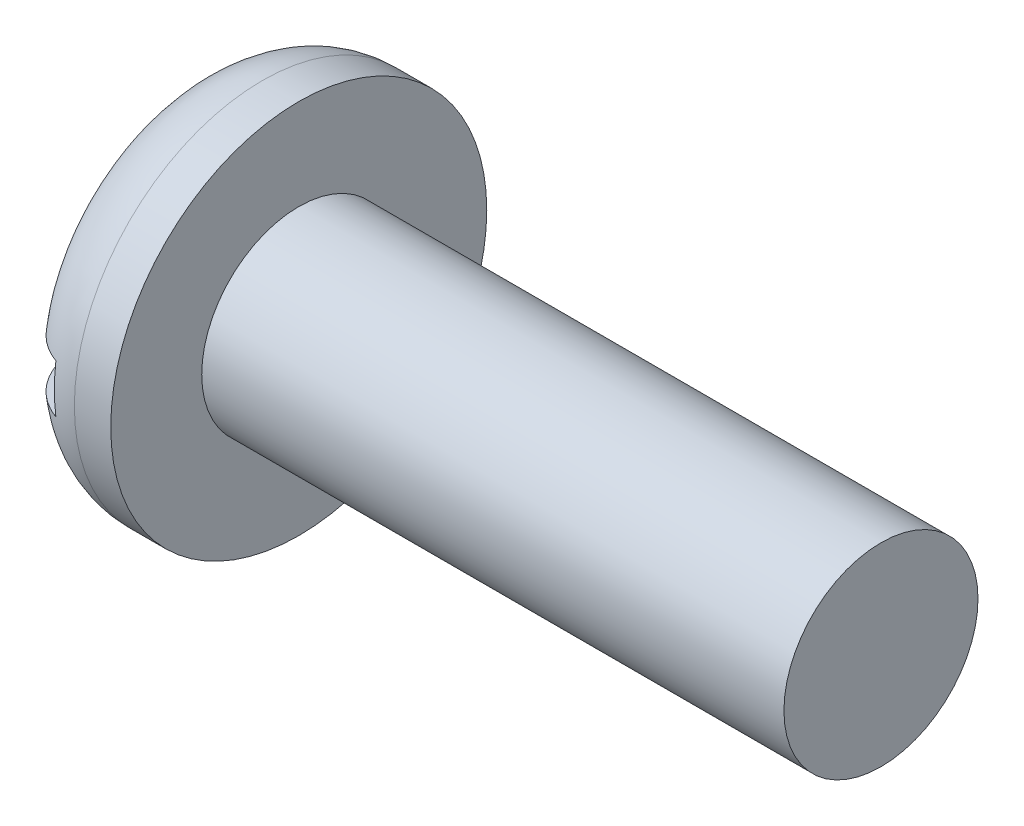
ISO-10303-21;
HEADER;
FILE_DESCRIPTION(('STEP AP214'),'2;1');
FILE_NAME('part.step','',(''),(''),'','','');
FILE_SCHEMA(('AUTOMOTIVE_DESIGN { 1 0 10303 214 1 1 1 1 }'));
ENDSEC;
DATA;
#1=APPLICATION_CONTEXT('core data for automotive mechanical design processes');
#2=APPLICATION_PROTOCOL_DEFINITION('international standard','automotive_design',2000,#1);
#3=PRODUCT_CONTEXT('',#1,'mechanical');
#4=PRODUCT('Part','Part','',(#3));
#5=PRODUCT_RELATED_PRODUCT_CATEGORY('part','',(#4));
#6=PRODUCT_DEFINITION_FORMATION('','',#4);
#7=PRODUCT_DEFINITION_CONTEXT('part definition',#1,'design');
#8=PRODUCT_DEFINITION('design','',#6,#7);
#9=PRODUCT_DEFINITION_SHAPE('','',#8);
#10=(LENGTH_UNIT() NAMED_UNIT(*) SI_UNIT(.MILLI.,.METRE.));
#11=(NAMED_UNIT(*) PLANE_ANGLE_UNIT() SI_UNIT($,.RADIAN.));
#12=(NAMED_UNIT(*) SI_UNIT($,.STERADIAN.) SOLID_ANGLE_UNIT());
#13=UNCERTAINTY_MEASURE_WITH_UNIT(LENGTH_MEASURE(1.E-05),#10,'distance_accuracy_value','');
#14=(GEOMETRIC_REPRESENTATION_CONTEXT(3) GLOBAL_UNCERTAINTY_ASSIGNED_CONTEXT((#13)) GLOBAL_UNIT_ASSIGNED_CONTEXT((#10,
#11,#12)) REPRESENTATION_CONTEXT('',''));
#15=CARTESIAN_POINT('',(0.,0.,0.));
#16=DIRECTION('',(0.,0.,1.));
#17=DIRECTION('',(1.,0.,0.));
#18=AXIS2_PLACEMENT_3D('',#15,#16,#17);
#19=CARTESIAN_POINT('',(0.,2.375,0.));
#20=DIRECTION('',(-1.,0.,0.));
#21=DIRECTION('',(0.,0.,1.));
#22=AXIS2_PLACEMENT_3D('',#19,#20,#21);
#23=PLANE('',#22);
#24=DIRECTION('',(0.,0.,1.));
#25=VECTOR('',#24,1.);
#26=CARTESIAN_POINT('',(0.,-0.5,-6.09500153369635));
#27=LINE('',#26,#25);
#28=CARTESIAN_POINT('',(0.,-0.5,-2.32177195262584));
#29=VERTEX_POINT('',#28);
#30=CARTESIAN_POINT('',(0.,-0.5,2.32177195262584));
#31=VERTEX_POINT('',#30);
#32=EDGE_CURVE('E94',#29,#31,#27,.T.);
#33=ORIENTED_EDGE('',*,*,#32,.F.);
#34=CARTESIAN_POINT('',(0.,0.,0.));
#35=DIRECTION('',(1.,0.,0.));
#36=DIRECTION('',(0.,0.,-1.));
#37=AXIS2_PLACEMENT_3D('',#34,#35,#36);
#38=CIRCLE('',#37,2.375);
#39=EDGE_CURVE('E103',#31,#29,#38,.T.);
#40=ORIENTED_EDGE('',*,*,#39,.F.);
#41=EDGE_LOOP('',(#33,#40));
#42=FACE_BOUND('',#41,.T.);
#43=ADVANCED_FACE('F39',(#42),#23,.T.);
#44=DIRECTION('',(0.,0.,-1.));
#45=VECTOR('',#44,1.);
#46=CARTESIAN_POINT('',(0.,0.5,-6.09500153369635));
#47=LINE('',#46,#45);
#48=CARTESIAN_POINT('',(0.,0.5,2.32177195262584));
#49=VERTEX_POINT('',#48);
#50=CARTESIAN_POINT('',(0.,0.5,-2.32177195262584));
#51=VERTEX_POINT('',#50);
#52=EDGE_CURVE('E85',#49,#51,#47,.T.);
#53=ORIENTED_EDGE('',*,*,#52,.F.);
#54=EDGE_CURVE('E92',#51,#49,#38,.T.);
#55=ORIENTED_EDGE('',*,*,#54,.F.);
#56=EDGE_LOOP('',(#53,#55));
#57=FACE_BOUND('',#56,.T.);
#58=ADVANCED_FACE('F41',(#57),#23,.T.);
#59=CARTESIAN_POINT('',(14.25,0.,0.));
#60=DIRECTION('',(1.,0.,0.));
#61=DIRECTION('',(0.,0.,-1.));
#62=AXIS2_PLACEMENT_3D('',#59,#60,#61);
#63=PLANE('',#62);
#64=CARTESIAN_POINT('',(14.25,0.,0.));
#65=DIRECTION('',(1.,0.,0.));
#66=DIRECTION('',(0.,0.,-1.));
#67=AXIS2_PLACEMENT_3D('',#64,#65,#66);
#68=CIRCLE('',#67,2.);
#69=CARTESIAN_POINT('',(14.25,0.,-2.));
#70=VERTEX_POINT('',#69);
#71=EDGE_CURVE('E121',#70,#70,#68,.T.);
#72=ORIENTED_EDGE('',*,*,#71,.T.);
#73=EDGE_LOOP('',(#72));
#74=FACE_BOUND('',#73,.T.);
#75=ADVANCED_FACE('F161',(#74),#63,.T.);
#76=CARTESIAN_POINT('',(0.,0.,0.));
#77=DIRECTION('',(1.,0.,0.));
#78=DIRECTION('',(0.,0.,-1.));
#79=AXIS2_PLACEMENT_3D('',#76,#77,#78);
#80=CYLINDRICAL_SURFACE('',#79,2.);
#81=CARTESIAN_POINT('',(2.25,0.,0.));
#82=DIRECTION('',(1.,0.,0.));
#83=DIRECTION('',(0.,0.,-1.));
#84=AXIS2_PLACEMENT_3D('',#81,#82,#83);
#85=CIRCLE('',#84,2.);
#86=CARTESIAN_POINT('',(2.25,0.,-2.));
#87=VERTEX_POINT('',#86);
#88=EDGE_CURVE('E117',#87,#87,#85,.T.);
#89=ORIENTED_EDGE('',*,*,#88,.T.);
#90=EDGE_LOOP('',(#89));
#91=FACE_BOUND('',#90,.T.);
#92=ORIENTED_EDGE('',*,*,#71,.F.);
#93=EDGE_LOOP('',(#92));
#94=FACE_BOUND('',#93,.T.);
#95=ADVANCED_FACE('F176',(#91,#94),#80,.T.);
#96=CARTESIAN_POINT('',(2.25,2.,0.));
#97=DIRECTION('',(1.,0.,0.));
#98=DIRECTION('',(0.,0.,-1.));
#99=AXIS2_PLACEMENT_3D('',#96,#97,#98);
#100=PLANE('',#99);
#101=CARTESIAN_POINT('',(2.25,0.,0.));
#102=DIRECTION('',(1.,0.,0.));
#103=DIRECTION('',(0.,0.,-1.));
#104=AXIS2_PLACEMENT_3D('',#101,#102,#103);
#105=CIRCLE('',#104,3.875);
#106=CARTESIAN_POINT('',(2.25,0.,-3.875));
#107=VERTEX_POINT('',#106);
#108=EDGE_CURVE('E108',#107,#107,#105,.T.);
#109=ORIENTED_EDGE('',*,*,#108,.T.);
#110=EDGE_LOOP('',(#109));
#111=FACE_BOUND('',#110,.T.);
#112=ORIENTED_EDGE('',*,*,#88,.F.);
#113=EDGE_LOOP('',(#112));
#114=FACE_BOUND('',#113,.T.);
#115=ADVANCED_FACE('F181',(#111,#114),#100,.T.);
#116=CARTESIAN_POINT('',(0.,0.,0.));
#117=DIRECTION('',(1.,0.,0.));
#118=DIRECTION('',(0.,0.,-1.));
#119=AXIS2_PLACEMENT_3D('',#116,#117,#118);
#120=CYLINDRICAL_SURFACE('',#119,3.875);
#121=CARTESIAN_POINT('',(1.5,0.,0.));
#122=DIRECTION('',(1.,0.,0.));
#123=DIRECTION('',(0.,0.,-1.));
#124=AXIS2_PLACEMENT_3D('',#121,#122,#123);
#125=CIRCLE('',#124,3.875);
#126=CARTESIAN_POINT('',(1.5,0.,-3.875));
#127=VERTEX_POINT('',#126);
#128=EDGE_CURVE('E102',#127,#127,#125,.T.);
#129=ORIENTED_EDGE('',*,*,#128,.T.);
#130=EDGE_LOOP('',(#129));
#131=FACE_BOUND('',#130,.T.);
#132=ORIENTED_EDGE('',*,*,#108,.F.);
#133=EDGE_LOOP('',(#132));
#134=FACE_BOUND('',#133,.T.);
#135=ADVANCED_FACE('F186',(#131,#134),#120,.T.);
#136=CARTESIAN_POINT('',(1.5,0.,0.));
#137=DIRECTION('',(1.,0.,0.));
#138=DIRECTION('',(0.,0.,-1.));
#139=AXIS2_PLACEMENT_3D('',#136,#137,#138);
#140=TOROIDAL_SURFACE('',#139,2.375,1.5);
#141=CARTESIAN_POINT('',(0.850475463109034,-0.5,0.892394072300073));
#142=CARTESIAN_POINT('',(0.770948501311582,-0.5,0.936183932032056));
#143=CARTESIAN_POINT('',(0.695217571392142,-0.5,0.98699983940831));
#144=CARTESIAN_POINT('',(0.553018732067695,-0.5,1.10039801850296));
#145=CARTESIAN_POINT('',(0.486569708731596,-0.5,1.16300368870758));
#146=CARTESIAN_POINT('',(0.363977782766483,-0.5,1.29883661258641));
#147=CARTESIAN_POINT('',(0.307951204962954,-0.5,1.37216911409017));
#148=CARTESIAN_POINT('',(0.208741799350523,-0.5,1.52700633362363));
#149=CARTESIAN_POINT('',(0.165551368600446,-0.5,1.60850617566988));
#150=CARTESIAN_POINT('',(0.0926591457035857,-0.5,1.77937259701625));
#151=CARTESIAN_POINT('',(0.0632573929631356,-0.5,1.86886777540709));
#152=CARTESIAN_POINT('',(0.02050759297926,-0.5,2.05163744263558));
#153=CARTESIAN_POINT('',(0.00715994216047413,-0.5,2.14491202473943));
#154=CARTESIAN_POINT('',(-0.00258317098535321,-0.5,2.3290103360419));
#155=CARTESIAN_POINT('',(0.000434252664724752,-0.5,2.41980296360857));
#156=CARTESIAN_POINT('',(0.0222132277135758,-0.5,2.59947989356123));
#157=CARTESIAN_POINT('',(0.0409713823167511,-0.5,2.68836460342547));
#158=CARTESIAN_POINT('',(0.0929581166056598,-0.5,2.85858459635553));
#159=CARTESIAN_POINT('',(0.125688309224663,-0.5,2.94007226163737));
#160=CARTESIAN_POINT('',(0.204659421395142,-0.5,3.09621614763654));
#161=CARTESIAN_POINT('',(0.250898616675705,-0.5,3.17087323860318));
#162=CARTESIAN_POINT('',(0.354462668617415,-0.5,3.30955249043577));
#163=CARTESIAN_POINT('',(0.411527336386186,-0.5,3.37376906060191));
#164=CARTESIAN_POINT('',(0.535753328244322,-0.5,3.49155473592557));
#165=CARTESIAN_POINT('',(0.602913886895751,-0.5,3.54512464756407));
#166=CARTESIAN_POINT('',(0.744481496806388,-0.5,3.63939206972404));
#167=CARTESIAN_POINT('',(0.818784289289062,-0.5,3.68024621114261));
#168=CARTESIAN_POINT('',(0.973229342153896,-0.5,3.74879857613961));
#169=CARTESIAN_POINT('',(1.05337134257331,-0.5,3.77649738498389));
#170=CARTESIAN_POINT('',(1.2166127916688,-0.5,3.81777068874582));
#171=CARTESIAN_POINT('',(1.29968752581548,-0.5,3.83144298416615));
#172=CARTESIAN_POINT('',(1.46695251473716,-0.5,3.8446034543064));
#173=CARTESIAN_POINT('',(1.5511427460993,-0.5,3.84409192625658));
#174=CARTESIAN_POINT('',(1.71800053954595,-0.5,3.82892160441665));
#175=CARTESIAN_POINT('',(1.80067169343304,-0.5,3.81430227070407));
#176=CARTESIAN_POINT('',(1.96238862729906,-0.5,3.77140217210699));
#177=CARTESIAN_POINT('',(2.04143442219859,-0.5,3.743121463453));
#178=CARTESIAN_POINT('',(2.19373427098577,-0.5,3.67369506017676));
#179=CARTESIAN_POINT('',(2.26698358033916,-0.5,3.63253896052127));
#180=CARTESIAN_POINT('',(2.40557250290686,-0.5,3.53856563418953));
#181=CARTESIAN_POINT('',(2.47091201940533,-0.5,3.48574826494909));
#182=CARTESIAN_POINT('',(2.59216072671487,-0.5,3.36971185505771));
#183=CARTESIAN_POINT('',(2.64802569774307,-0.5,3.30644662072203));
#184=CARTESIAN_POINT('',(2.74845297652547,-0.5,3.17150851700583));
#185=CARTESIAN_POINT('',(2.79301493676934,-0.5,3.09983538922425));
#186=CARTESIAN_POINT('',(2.8700373760294,-0.5,2.9494260855956));
#187=CARTESIAN_POINT('',(2.90238279462768,-0.5,2.8706310160964));
#188=CARTESIAN_POINT('',(2.95360795581685,-0.5,2.70878506337659));
#189=CARTESIAN_POINT('',(2.97248702942544,-0.5,2.62573396894445));
#190=CARTESIAN_POINT('',(2.9966040222594,-0.5,2.45635016258261));
#191=CARTESIAN_POINT('',(3.00162360603361,-0.5,2.3699864235397));
#192=CARTESIAN_POINT('',(2.99745813344462,-0.5,2.19760720402671));
#193=CARTESIAN_POINT('',(2.98827133988996,-0.5,2.11159176743752));
#194=CARTESIAN_POINT('',(2.95576374332082,-0.5,1.94005759520878));
#195=CARTESIAN_POINT('',(2.93209646839621,-0.5,1.85460463861171));
#196=CARTESIAN_POINT('',(2.8712429628627,-0.5,1.68867563978155));
#197=CARTESIAN_POINT('',(2.83405627434762,-0.5,1.60819976623165));
#198=CARTESIAN_POINT('',(2.74584585312029,-0.5,1.45147996276027));
#199=CARTESIAN_POINT('',(2.69438240176956,-0.5,1.37548359156257));
#200=CARTESIAN_POINT('',(2.57976101591973,-0.5,1.23279178692265));
#201=CARTESIAN_POINT('',(2.51659262017361,-0.5,1.16610476790229));
#202=CARTESIAN_POINT('',(2.37806157917661,-0.5,1.04200713024241));
#203=CARTESIAN_POINT('',(2.30237856816069,-0.5,0.984953128798729));
#204=CARTESIAN_POINT('',(2.14211601793254,-0.5,0.885125352476465));
#205=CARTESIAN_POINT('',(2.05754739481322,-0.5,0.842334319000094));
#206=CARTESIAN_POINT('',(1.90174471531391,-0.5,0.781950602000002));
#207=CARTESIAN_POINT('',(1.83187715789648,-0.5,0.760834773647919));
#208=CARTESIAN_POINT('',(1.68962514703893,-0.5,0.730623970748589));
#209=CARTESIAN_POINT('',(1.61724468533248,-0.5,0.721510753008345));
#210=CARTESIAN_POINT('',(1.47179478021541,-0.5,0.716240071165603));
#211=CARTESIAN_POINT('',(1.39872393839101,-0.5,0.720120698591899));
#212=CARTESIAN_POINT('',(1.25436751540151,-0.5,0.740476042882161));
#213=CARTESIAN_POINT('',(1.18308239495948,-0.5,0.756953976031447));
#214=CARTESIAN_POINT('',(1.06799137002741,-0.5,0.793403165464027));
#215=CARTESIAN_POINT('',(1.02315055284674,-0.5,0.810234951465433));
#216=CARTESIAN_POINT('',(0.935347224023042,-0.5,0.848192827239365));
#217=CARTESIAN_POINT('',(0.892384257651255,-0.5,0.869317870304399));
#218=CARTESIAN_POINT('',(0.850475463109034,-0.5,0.892394072300073));
#219=B_SPLINE_CURVE_WITH_KNOTS('',3,(#141,#142,#143,#144,#145,#146,#147,#148,#149,#150,#151,
#152,#153,#154,#155,#156,#157,#158,#159,#160,#161,#162,#163,#164,#165,#166,#167,#168,#169,#170,
#171,#172,#173,#174,#175,#176,#177,#178,#179,#180,#181,#182,#183,#184,#185,#186,#187,#188,#189,
#190,#191,#192,#193,#194,#195,#196,#197,#198,#199,#200,#201,#202,#203,#204,#205,#206,#207,#208,
#209,#210,#211,#212,#213,#214,#215,#216,#217,#218),.UNSPECIFIED.,.T.,.F.,(4,2,2,2,2,2,2,2,2,2,2,
2,2,2,2,2,2,2,2,2,2,2,2,2,2,2,2,2,2,2,2,2,2,2,2,2,2,2,4),(0.,0.272178906669931,
0.544903795855668,0.820510574792962,1.09595378303791,1.3771404404632,1.65833404110035,
1.92950779380412,2.20062304318909,2.46278397479544,2.72491145914156,2.98139371822549,
3.23785654144879,3.49102234179003,3.74417687801628,3.99555403298078,4.24692592019478,
4.49759674232794,4.74826653270345,4.99913942328606,5.25001538107077,5.50203180114496,
5.75405596850841,6.00839788179795,6.26275242942819,6.52109169106241,6.77946254556754,
7.04427119794764,7.30908882030375,7.58319806816234,7.85755349214954,8.14051526970138,
8.42313340182248,8.6411964152664,8.85892760304421,9.0772976291531,9.29572342710552,
9.43919009487935,9.582621826968),.UNSPECIFIED.);
#220=CARTESIAN_POINT('',(1.,-0.5,3.75608032678645));
#221=VERTEX_POINT('',#220);
#222=EDGE_CURVE('E11',#31,#221,#219,.T.);
#223=ORIENTED_EDGE('',*,*,#222,.F.);
#224=ORIENTED_EDGE('',*,*,#39,.T.);
#225=CARTESIAN_POINT('',(0.466326616105874,-0.5,-3.42568034433179));
#226=CARTESIAN_POINT('',(0.404878695009682,-0.5,-3.36662249898446));
#227=CARTESIAN_POINT('',(0.348443027739107,-0.5,-3.30229782833416));
#228=CARTESIAN_POINT('',(0.247201408541073,-0.5,-3.16502498565754));
#229=CARTESIAN_POINT('',(0.20240391887452,-0.5,-3.09207059463621));
#230=CARTESIAN_POINT('',(0.125692466968891,-0.5,-2.93975716651545));
#231=CARTESIAN_POINT('',(0.0937674435746432,-0.5,-2.86040369873895));
#232=CARTESIAN_POINT('',(0.0435265248335604,-0.5,-2.69752127946736));
#233=CARTESIAN_POINT('',(0.0252088850762303,-0.5,-2.61399286464904));
#234=CARTESIAN_POINT('',(0.00238342599656015,-0.5,-2.44404990324952));
#235=CARTESIAN_POINT('',(-0.00195528555923191,-0.5,-2.35761270488593));
#236=CARTESIAN_POINT('',(0.00357041417720543,-0.5,-2.1851967449968));
#237=CARTESIAN_POINT('',(0.0134368207594079,-0.5,-2.09921804957657));
#238=CARTESIAN_POINT('',(0.0473046529117004,-0.5,-1.92784303479123));
#239=CARTESIAN_POINT('',(0.071656030560436,-0.5,-1.84251599667904));
#240=CARTESIAN_POINT('',(0.133845319016473,-0.5,-1.67694656966461));
#241=CARTESIAN_POINT('',(0.171683689901861,-0.5,-1.59670435432952));
#242=CARTESIAN_POINT('',(0.261181101347896,-0.5,-1.44054659727418));
#243=CARTESIAN_POINT('',(0.31328060466788,-0.5,-1.36488354601801));
#244=CARTESIAN_POINT('',(0.429120205880214,-0.5,-1.22296179485762));
#245=CARTESIAN_POINT('',(0.492870937178379,-0.5,-1.15671178467445));
#246=CARTESIAN_POINT('',(0.632476599040152,-0.5,-1.03365855100393));
#247=CARTESIAN_POINT('',(0.708642845053239,-0.5,-0.977207455494401));
#248=CARTESIAN_POINT('',(0.869789038634869,-0.5,-0.878722986787731));
#249=CARTESIAN_POINT('',(0.954757803980425,-0.5,-0.836671606574479));
#250=CARTESIAN_POINT('',(1.11092557985987,-0.5,-0.777847977968796));
#251=CARTESIAN_POINT('',(1.18076892707155,-0.5,-0.757479589964368));
#252=CARTESIAN_POINT('',(1.32283432255285,-0.5,-0.728772951394207));
#253=CARTESIAN_POINT('',(1.39505211760793,-0.5,-0.720414273827979));
#254=CARTESIAN_POINT('',(1.54000423064084,-0.5,-0.716582972619554));
#255=CARTESIAN_POINT('',(1.61273936064006,-0.5,-0.721140461009347));
#256=CARTESIAN_POINT('',(1.75637572243357,-0.5,-0.742689939762001));
#257=CARTESIAN_POINT('',(1.82727486473195,-0.5,-0.759695504070827));
#258=CARTESIAN_POINT('',(1.96435554929152,-0.5,-0.804262158450439));
#259=CARTESIAN_POINT('',(2.03059431676918,-0.5,-0.831650487435042));
#260=CARTESIAN_POINT('',(2.15853217509532,-0.5,-0.895473242894636));
#261=CARTESIAN_POINT('',(2.22022984065413,-0.5,-0.931910493939636));
#262=CARTESIAN_POINT('',(2.34873979143005,-0.5,-1.01977046561801));
#263=CARTESIAN_POINT('',(2.4145213405359,-0.5,-1.07270445666082));
#264=CARTESIAN_POINT('',(2.53741349889164,-0.5,-1.18783992695864));
#265=CARTESIAN_POINT('',(2.59451995491339,-0.5,-1.2500458171071));
#266=CARTESIAN_POINT('',(2.70458892321473,-0.5,-1.38966883089801));
#267=CARTESIAN_POINT('',(2.75638948823476,-0.5,-1.46800782548101));
#268=CARTESIAN_POINT('',(2.84605820460511,-0.5,-1.63230502342027));
#269=CARTESIAN_POINT('',(2.88392539361265,-0.5,-1.71826375254357));
#270=CARTESIAN_POINT('',(2.94422385696166,-0.5,-1.89512914272302));
#271=CARTESIAN_POINT('',(2.96670707150848,-0.5,-1.98601802508867));
#272=CARTESIAN_POINT('',(2.99544291257437,-0.5,-2.17033166700692));
#273=CARTESIAN_POINT('',(3.00169847494582,-0.5,-2.26375596476982));
#274=CARTESIAN_POINT('',(2.99758906451692,-0.5,-2.44673346143605));
#275=CARTESIAN_POINT('',(2.9878382058558,-0.5,-2.53630051828829));
#276=CARTESIAN_POINT('',(2.95294921077456,-0.5,-2.71238822069424));
#277=CARTESIAN_POINT('',(2.92781379113257,-0.5,-2.79890940127075));
#278=CARTESIAN_POINT('',(2.86376453981607,-0.5,-2.96364707615314));
#279=CARTESIAN_POINT('',(2.82529520673823,-0.5,-3.04203654969976));
#280=CARTESIAN_POINT('',(2.73549167406712,-0.5,-3.19106474415534));
#281=CARTESIAN_POINT('',(2.68415896124276,-0.5,-3.26170435944891));
#282=CARTESIAN_POINT('',(2.57119000761087,-0.5,-3.39179941120036));
#283=CARTESIAN_POINT('',(2.50977267772368,-0.5,-3.45144503071466));
#284=CARTESIAN_POINT('',(2.37769565059447,-0.5,-3.55943321829672));
#285=CARTESIAN_POINT('',(2.30703658545092,-0.5,-3.6077765587663));
#286=CARTESIAN_POINT('',(2.15935948208884,-0.5,-3.69122943444147));
#287=CARTESIAN_POINT('',(2.08242310865451,-0.5,-3.72648353655529));
#288=CARTESIAN_POINT('',(1.92370137715862,-0.5,-3.78348514666682));
#289=CARTESIAN_POINT('',(1.84191629457087,-0.5,-3.80523342117853));
#290=CARTESIAN_POINT('',(1.67635175271815,-0.5,-3.83449114039664));
#291=CARTESIAN_POINT('',(1.59258741540113,-0.5,-3.84208622620343));
#292=CARTESIAN_POINT('',(1.42496363249453,-0.5,-3.84307507512542));
#293=CARTESIAN_POINT('',(1.34110417723449,-0.5,-3.83646723473495));
#294=CARTESIAN_POINT('',(1.17583912532437,-0.5,-3.80926811059201));
#295=CARTESIAN_POINT('',(1.09442954135156,-0.5,-3.78870099350905));
#296=CARTESIAN_POINT('',(0.936251519617922,-0.5,-3.73421446690147));
#297=CARTESIAN_POINT('',(0.859480056353847,-0.5,-3.70030387238233));
#298=CARTESIAN_POINT('',(0.727918095506727,-0.5,-3.62845429411074));
#299=CARTESIAN_POINT('',(0.67186571290037,-0.5,-3.59279962911871));
#300=CARTESIAN_POINT('',(0.564973087536421,-0.5,-3.51438614835386));
#301=CARTESIAN_POINT('',(0.514132943170078,-0.5,-3.47162719851359));
#302=CARTESIAN_POINT('',(0.466326616105874,-0.5,-3.42568034433179));
#303=B_SPLINE_CURVE_WITH_KNOTS('',3,(#225,#226,#227,#228,#229,#230,#231,#232,#233,#234,#235,
#236,#237,#238,#239,#240,#241,#242,#243,#244,#245,#246,#247,#248,#249,#250,#251,#252,#253,#254,
#255,#256,#257,#258,#259,#260,#261,#262,#263,#264,#265,#266,#267,#268,#269,#270,#271,#272,#273,
#274,#275,#276,#277,#278,#279,#280,#281,#282,#283,#284,#285,#286,#287,#288,#289,#290,#291,#292,
#293,#294,#295,#296,#297,#298,#299,#300,#301,#302),.UNSPECIFIED.,.T.,.F.,(4,2,2,2,2,2,2,2,2,2,2,
2,2,2,2,2,2,2,2,2,2,2,2,2,2,2,2,2,2,2,2,2,2,2,2,2,2,2,4),(0.,0.255439366345301,
0.511063949204243,0.766468406414535,1.02184011617317,1.28028976576573,1.53877572144897,
1.80377581061048,2.06878494051235,2.3431427877186,2.61775228738441,2.90078562605088,
3.18346372444117,3.40081592335594,3.61779799420893,3.83528634085532,4.05301220060845,
4.26726387737578,4.48158251584072,4.73387521684161,4.98628832566577,5.26669468560399,
5.54712040886133,5.82659460900951,6.10601824409543,6.37496970440307,6.64387368394649,
6.90456073019757,7.16521765973163,7.42082414398701,7.67641315489392,7.92908878334474,
8.18175007005222,8.43287747283781,8.68403322931317,8.93475528364443,9.18531198259913,
9.38403941231853,9.58277059271859),.UNSPECIFIED.);
#304=CARTESIAN_POINT('',(1.,-0.5,-3.75608032678645));
#305=VERTEX_POINT('',#304);
#306=EDGE_CURVE('E134',#305,#29,#303,.T.);
#307=ORIENTED_EDGE('',*,*,#306,.F.);
#308=CARTESIAN_POINT('',(1.,0.,0.));
#309=DIRECTION('',(1.,0.,0.));
#310=DIRECTION('',(0.,0.,-1.));
#311=AXIS2_PLACEMENT_3D('',#308,#309,#310);
#312=CIRCLE('',#311,3.78921356237309);
#313=CARTESIAN_POINT('',(1.,0.5,-3.75608032678645));
#314=VERTEX_POINT('',#313);
#315=EDGE_CURVE('E125',#314,#305,#312,.F.);
#316=ORIENTED_EDGE('',*,*,#315,.F.);
#317=CARTESIAN_POINT('',(0.466326616105874,0.5,-3.42568034433179));
#318=CARTESIAN_POINT('',(0.526838105225097,0.5,-3.48382893410671));
#319=CARTESIAN_POINT('',(0.592281371418577,0.5,-3.53693908633568));
#320=CARTESIAN_POINT('',(0.731206616384681,0.5,-3.6314784823373));
#321=CARTESIAN_POINT('',(0.804698459688595,0.5,-3.67289316439068));
#322=CARTESIAN_POINT('',(0.957589056806997,0.5,-3.74276225346407));
#323=CARTESIAN_POINT('',(1.03698609071001,0.5,-3.77122041706109));
#324=CARTESIAN_POINT('',(1.19941872112502,0.5,-3.81434208359574));
#325=CARTESIAN_POINT('',(1.2824533561889,0.5,-3.8290092088702));
#326=CARTESIAN_POINT('',(1.44953075120893,0.5,-3.84410652147915));
#327=CARTESIAN_POINT('',(1.53356928649291,0.5,-3.84458347293351));
#328=CARTESIAN_POINT('',(1.70053301481677,0.5,-3.8314044628544));
#329=CARTESIAN_POINT('',(1.7834581777354,0.5,-3.81774811973507));
#330=CARTESIAN_POINT('',(1.9457462624119,0.5,-3.77672510210819));
#331=CARTESIAN_POINT('',(2.02511300574715,0.5,-3.7493735395218));
#332=CARTESIAN_POINT('',(2.17814334258999,0.5,-3.68176584327256));
#333=CARTESIAN_POINT('',(2.25180692941533,0.5,-3.64150969449005));
#334=CARTESIAN_POINT('',(2.39154821805859,0.5,-3.54914595694046));
#335=CARTESIAN_POINT('',(2.45760659196871,0.5,-3.49700913356404));
#336=CARTESIAN_POINT('',(2.58010106683934,0.5,-3.38245075508913));
#337=CARTESIAN_POINT('',(2.63653698443588,0.5,-3.3200290040473));
#338=CARTESIAN_POINT('',(2.73860075775283,0.5,-3.18625211500775));
#339=CARTESIAN_POINT('',(2.78415547204755,0.5,-3.11484119241818));
#340=CARTESIAN_POINT('',(2.86278750831159,0.5,-2.96545656489872));
#341=CARTESIAN_POINT('',(2.89586433465462,0.5,-2.88748259943279));
#342=CARTESIAN_POINT('',(2.94905825020523,0.5,-2.72620402840245));
#343=CARTESIAN_POINT('',(2.9690161649552,0.5,-2.64284696200576));
#344=CARTESIAN_POINT('',(2.99494045168933,0.5,-2.47399114501672));
#345=CARTESIAN_POINT('',(3.00090582376602,0.5,-2.38849224180987));
#346=CARTESIAN_POINT('',(2.99885169485714,0.5,-2.21599235505797));
#347=CARTESIAN_POINT('',(2.99055603930183,0.5,-2.12899474472561));
#348=CARTESIAN_POINT('',(2.95990940586043,0.5,-1.95751816371855));
#349=CARTESIAN_POINT('',(2.93755652149824,0.5,-1.87303953630257));
#350=CARTESIAN_POINT('',(2.87876363473233,0.5,-1.70628499532603));
#351=CARTESIAN_POINT('',(2.84192146642002,0.5,-1.62415100572841));
#352=CARTESIAN_POINT('',(2.75546314908324,0.5,-1.4669199024373));
#353=CARTESIAN_POINT('',(2.70584566877295,0.5,-1.39182352323005));
#354=CARTESIAN_POINT('',(2.59322788541445,0.5,-1.24786389092048));
#355=CARTESIAN_POINT('',(2.52979926048223,0.5,-1.17933538792112));
#356=CARTESIAN_POINT('',(2.39236546161518,0.5,-1.05365436881523));
#357=CARTESIAN_POINT('',(2.31834739597413,0.5,-0.996515925044166));
#358=CARTESIAN_POINT('',(2.16084529453532,0.5,-0.895491080607459));
#359=CARTESIAN_POINT('',(2.07729032206506,0.5,-0.851714260900348));
#360=CARTESIAN_POINT('',(1.90334865830961,0.5,-0.781217719865808));
#361=CARTESIAN_POINT('',(1.81298115219786,0.5,-0.754451962369341));
#362=CARTESIAN_POINT('',(1.64070423236304,0.5,-0.72350586849891));
#363=CARTESIAN_POINT('',(1.55925342416,0.5,-0.716810108948336));
#364=CARTESIAN_POINT('',(1.39665906682466,0.5,-0.719725304784161));
#365=CARTESIAN_POINT('',(1.31551542803241,0.5,-0.729331063299898));
#366=CARTESIAN_POINT('',(1.16750104374969,0.5,-0.761149118037345));
#367=CARTESIAN_POINT('',(1.10020073883343,0.5,-0.781448606182595));
#368=CARTESIAN_POINT('',(0.969301526910857,0.5,-0.831692534517682));
#369=CARTESIAN_POINT('',(0.905704904200541,0.5,-0.861642854136649));
#370=CARTESIAN_POINT('',(0.774943813899131,0.5,-0.934407786778408));
#371=CARTESIAN_POINT('',(0.708440390528845,0.5,-0.97840741776482));
#372=CARTESIAN_POINT('',(0.582475009247014,0.5,-1.07552189193934));
#373=CARTESIAN_POINT('',(0.523015586154423,0.5,-1.12863999971887));
#374=CARTESIAN_POINT('',(0.403724793749522,0.5,-1.25147432248108));
#375=CARTESIAN_POINT('',(0.3452195437246,0.5,-1.32248642166467));
#376=CARTESIAN_POINT('',(0.240583497879846,0.5,-1.4731305749344));
#377=CARTESIAN_POINT('',(0.194456104610411,0.5,-1.55276499078408));
#378=CARTESIAN_POINT('',(0.115062016915172,0.5,-1.72075619947094));
#379=CARTESIAN_POINT('',(0.0821569413819122,0.5,-1.80928475165214));
#380=CARTESIAN_POINT('',(0.0322608520263359,0.5,-1.99071999346419));
#381=CARTESIAN_POINT('',(0.0152666169464375,0.5,-2.08362579288938));
#382=CARTESIAN_POINT('',(-0.00168666861008324,0.5,-2.26780799625673));
#383=CARTESIAN_POINT('',(-0.00220314836380107,0.5,-2.3590330251819));
#384=CARTESIAN_POINT('',(0.0126596718333073,0.5,-2.54021127803838));
#385=CARTESIAN_POINT('',(0.0280405949463158,0.5,-2.63016437115138));
#386=CARTESIAN_POINT('',(0.0736300557097482,0.5,-2.8029744585135));
#387=CARTESIAN_POINT('',(0.103321249697288,0.5,-2.88596844450892));
#388=CARTESIAN_POINT('',(0.176519955739698,0.5,-3.04552845740894));
#389=CARTESIAN_POINT('',(0.220006523555433,0.5,-3.12210400747171));
#390=CARTESIAN_POINT('',(0.298515286919206,0.5,-3.23603555461691));
#391=CARTESIAN_POINT('',(0.329379045979074,0.5,-3.2763177860006));
#392=CARTESIAN_POINT('',(0.395003946200927,0.5,-3.35357323728819));
#393=CARTESIAN_POINT('',(0.429765064600163,0.5,-3.39054647651618));
#394=CARTESIAN_POINT('',(0.466326616105874,0.5,-3.42568034433179));
#395=B_SPLINE_CURVE_WITH_KNOTS('',3,(#317,#318,#319,#320,#321,#322,#323,#324,#325,#326,#327,
#328,#329,#330,#331,#332,#333,#334,#335,#336,#337,#338,#339,#340,#341,#342,#343,#344,#345,#346,
#347,#348,#349,#350,#351,#352,#353,#354,#355,#356,#357,#358,#359,#360,#361,#362,#363,#364,#365,
#366,#367,#368,#369,#370,#371,#372,#373,#374,#375,#376,#377,#378,#379,#380,#381,#382,#383,#384,
#385,#386,#387,#388,#389,#390,#391,#392,#393,#394),.UNSPECIFIED.,.T.,.F.,(4,2,2,2,2,2,2,2,2,2,2,
2,2,2,2,2,2,2,2,2,2,2,2,2,2,2,2,2,2,2,2,2,2,2,2,2,2,2,4),(0.,0.251581239900099,
0.503474349609891,0.755294379548243,1.00704824826183,1.25797236274469,1.50890325212323,
1.75955786125914,2.01021276407578,2.26149124074374,2.51277450519872,2.76570209466404,
3.01863972944857,3.27459228192926,3.53056312422918,3.79154666363987,4.05256560591868,
4.32140835808674,4.59027913708493,4.86912815832498,5.14831958886046,5.42974273277584,
5.71040099572675,5.95400306933819,6.19752749799274,6.40760245231077,6.61780563013013,
6.85613222937663,7.09454433279973,7.36931479037309,7.64416070243165,7.92608156157269,
8.20794533157312,8.48026338771189,8.75260925091091,9.01577388103256,9.27854086951267,
9.43054926187737,9.58255676647464),.UNSPECIFIED.);
#396=EDGE_CURVE('E100',#51,#314,#395,.T.);
#397=ORIENTED_EDGE('',*,*,#396,.F.);
#398=ORIENTED_EDGE('',*,*,#54,.T.);
#399=CARTESIAN_POINT('',(0.850475463109034,0.5,0.892394072300073));
#400=CARTESIAN_POINT('',(0.921276886086174,0.5,0.853406527092485));
#401=CARTESIAN_POINT('',(0.995168395375315,0.5,0.819939055166306));
#402=CARTESIAN_POINT('',(1.14761104500787,0.5,0.766226077005017));
#403=CARTESIAN_POINT('',(1.22615714432689,0.5,0.745966541784515));
#404=CARTESIAN_POINT('',(1.38409968359617,0.5,0.721047237339792));
#405=CARTESIAN_POINT('',(1.46344544249366,0.5,0.716075317031482));
#406=CARTESIAN_POINT('',(1.62159461068216,0.5,0.721534107469589));
#407=CARTESIAN_POINT('',(1.700398027696,0.5,0.731964598431181));
#408=CARTESIAN_POINT('',(1.84593033713181,0.5,0.764882558633942));
#409=CARTESIAN_POINT('',(1.91301304139069,0.5,0.785863529128991));
#410=CARTESIAN_POINT('',(2.04340225353422,0.5,0.837371330184684));
#411=CARTESIAN_POINT('',(2.10670662464081,0.5,0.867903502495256));
#412=CARTESIAN_POINT('',(2.23720702047191,0.5,0.942058707041487));
#413=CARTESIAN_POINT('',(2.30369894699144,0.5,0.986918691737366));
#414=CARTESIAN_POINT('',(2.42949239118754,0.5,1.08577533882682));
#415=CARTESIAN_POINT('',(2.48879109593389,0.5,1.13977555588846));
#416=CARTESIAN_POINT('',(2.60734489363422,0.5,1.26430047600443));
#417=CARTESIAN_POINT('',(2.66528147799216,0.5,1.33608835573899));
#418=CARTESIAN_POINT('',(2.76861408996222,0.5,1.48820574257352));
#419=CARTESIAN_POINT('',(2.81400704422914,0.5,1.56853733632457));
#420=CARTESIAN_POINT('',(2.89162168882051,0.5,1.73755105491964));
#421=CARTESIAN_POINT('',(2.92352501905889,0.5,1.82638009542682));
#422=CARTESIAN_POINT('',(2.97137146889696,0.5,2.00824311594709));
#423=CARTESIAN_POINT('',(2.98731713888978,0.5,2.10127642153916));
#424=CARTESIAN_POINT('',(3.00219030299298,0.5,2.28547853197705));
#425=CARTESIAN_POINT('',(3.00168368432321,0.5,2.37660157406858));
#426=CARTESIAN_POINT('',(2.98481565588786,0.5,2.55737162536903));
#427=CARTESIAN_POINT('',(2.9684571602576,0.5,2.64701890279513));
#428=CARTESIAN_POINT('',(2.92102154188431,0.5,2.81905794792594));
#429=CARTESIAN_POINT('',(2.89046220892433,0.5,2.90159265601782));
#430=CARTESIAN_POINT('',(2.81560897582706,0.5,3.06018079290515));
#431=CARTESIAN_POINT('',(2.77131694661249,0.5,3.13623510278245));
#432=CARTESIAN_POINT('',(2.67136534119788,0.5,3.27791947592736));
#433=CARTESIAN_POINT('',(2.6159821996623,0.5,3.34374465924086));
#434=CARTESIAN_POINT('',(2.49481526499704,0.5,3.46500348032381));
#435=CARTESIAN_POINT('',(2.42903230128353,0.5,3.52043794601339));
#436=CARTESIAN_POINT('',(2.2898991366397,0.5,3.61857892110075));
#437=CARTESIAN_POINT('',(2.21666233422863,0.5,3.66144625482458));
#438=CARTESIAN_POINT('',(2.0639912256421,0.5,3.73417080094827));
#439=CARTESIAN_POINT('',(1.98455720490072,0.5,3.76402861212958));
#440=CARTESIAN_POINT('',(1.82238204346423,0.5,3.80967631239254));
#441=CARTESIAN_POINT('',(1.7396697609221,0.5,3.82556877745618));
#442=CARTESIAN_POINT('',(1.57275053411185,0.5,3.84319440367883));
#443=CARTESIAN_POINT('',(1.48854362403218,0.5,3.84492788829639));
#444=CARTESIAN_POINT('',(1.32130134134098,0.5,3.83420174736662));
#445=CARTESIAN_POINT('',(1.23826315351454,0.5,3.82178594412359));
#446=CARTESIAN_POINT('',(1.07544888953084,0.5,3.78319613002816));
#447=CARTESIAN_POINT('',(0.995672797082467,0.5,3.75702218789385));
#448=CARTESIAN_POINT('',(0.841593525980238,0.5,3.69166250867441));
#449=CARTESIAN_POINT('',(0.767293277089051,0.5,3.65246986701554));
#450=CARTESIAN_POINT('',(0.626291944750913,0.5,3.56221646505951));
#451=CARTESIAN_POINT('',(0.559590940285376,0.5,3.51115558142861));
#452=CARTESIAN_POINT('',(0.435363973329928,0.5,3.39840116684983));
#453=CARTESIAN_POINT('',(0.377878012613674,0.5,3.33666357566021));
#454=CARTESIAN_POINT('',(0.273982378217856,0.5,3.20448640922472));
#455=CARTESIAN_POINT('',(0.227573019273799,0.5,3.13404658679605));
#456=CARTESIAN_POINT('',(0.146685779615049,0.5,2.98581895923958));
#457=CARTESIAN_POINT('',(0.11231611693068,0.5,2.90797212548439));
#458=CARTESIAN_POINT('',(0.0569217178581776,0.5,2.74767180334006));
#459=CARTESIAN_POINT('',(0.0358977794706384,0.5,2.66521803980264));
#460=CARTESIAN_POINT('',(0.00741028013704185,0.5,2.4967230522167));
#461=CARTESIAN_POINT('',(0.000156242909232934,0.5,2.41064646024413));
#462=CARTESIAN_POINT('',(-0.000151279794042384,0.5,2.23847939888107));
#463=CARTESIAN_POINT('',(0.00679581476364033,0.5,2.15238892906737));
#464=CARTESIAN_POINT('',(0.0348132660881944,0.5,1.98042614141221));
#465=CARTESIAN_POINT('',(0.0562177475666967,0.5,1.89460838514809));
#466=CARTESIAN_POINT('',(0.112654330626841,0.5,1.72755940345287));
#467=CARTESIAN_POINT('',(0.147691913234036,0.5,1.64633003779004));
#468=CARTESIAN_POINT('',(0.23168023568406,0.5,1.48775378781102));
#469=CARTESIAN_POINT('',(0.281075374101474,0.5,1.41064259624885));
#470=CARTESIAN_POINT('',(0.391682690697622,0.5,1.26549276935831));
#471=CARTESIAN_POINT('',(0.452886344149195,0.5,1.19744764865982));
#472=CARTESIAN_POINT('',(0.569050753844832,0.5,1.08773641614121));
#473=CARTESIAN_POINT('',(0.621804760326905,0.5,1.04371052739365));
#474=CARTESIAN_POINT('',(0.732453356940164,0.5,0.962592137061326));
#475=CARTESIAN_POINT('',(0.790350190514362,0.5,0.925502683466833));
#476=CARTESIAN_POINT('',(0.850475463109034,0.5,0.892394072300073));
#477=B_SPLINE_CURVE_WITH_KNOTS('',3,(#399,#400,#401,#402,#403,#404,#405,#406,#407,#408,#409,
#410,#411,#412,#413,#414,#415,#416,#417,#418,#419,#420,#421,#422,#423,#424,#425,#426,#427,#428,
#429,#430,#431,#432,#433,#434,#435,#436,#437,#438,#439,#440,#441,#442,#443,#444,#445,#446,#447,
#448,#449,#450,#451,#452,#453,#454,#455,#456,#457,#458,#459,#460,#461,#462,#463,#464,#465,#466,
#467,#468,#469,#470,#471,#472,#473,#474,#475,#476),.UNSPECIFIED.,.T.,.F.,(4,2,2,2,2,2,2,2,2,2,2,
2,2,2,2,2,2,2,2,2,2,2,2,2,2,2,2,2,2,2,2,2,2,2,2,2,2,2,4),(0.,0.242253274712786,
0.484248815846756,0.721269192889093,0.958286187800021,1.1683415683483,1.37851463832068,
1.6182356409191,1.85805008695657,2.13353618391593,2.40908971866514,2.69082557199338,
2.97251639039921,3.24452887296924,3.51649135951447,3.77923381986217,4.04194050027364,
4.29877086208049,4.55558075124005,4.80894428138162,5.06229614888052,5.3137711975354,
5.56524050128626,5.81593308147061,6.06662440952697,6.31744890662875,6.56827601039325,
6.82016405799425,7.0720592620028,7.32616377446314,7.58028347953883,7.83823982558352,
8.09620670784627,8.36034923044088,8.62459805829296,8.89810387602192,9.1714129800246,
9.3770467225798,9.58277061295643),.UNSPECIFIED.);
#478=CARTESIAN_POINT('',(1.,0.5,3.75608032678645));
#479=VERTEX_POINT('',#478);
#480=EDGE_CURVE('E53',#479,#49,#477,.T.);
#481=ORIENTED_EDGE('',*,*,#480,.F.);
#482=EDGE_CURVE('E65',#221,#479,#312,.F.);
#483=ORIENTED_EDGE('',*,*,#482,.F.);
#484=EDGE_LOOP('',(#223,#224,#307,#316,#397,#398,#481,#483));
#485=FACE_BOUND('',#484,.T.);
#486=ORIENTED_EDGE('',*,*,#128,.F.);
#487=EDGE_LOOP('',(#486));
#488=FACE_BOUND('',#487,.T.);
#489=ADVANCED_FACE('F97',(#485,#488),#140,.T.);
#490=CARTESIAN_POINT('',(1.,-0.5,-6.09500153369635));
#491=DIRECTION('',(0.,-1.,0.));
#492=DIRECTION('',(0.,0.,-1.));
#493=AXIS2_PLACEMENT_3D('',#490,#491,#492);
#494=PLANE('',#493);
#495=ORIENTED_EDGE('',*,*,#306,.T.);
#496=ORIENTED_EDGE('',*,*,#32,.T.);
#497=ORIENTED_EDGE('',*,*,#222,.T.);
#498=DIRECTION('',(0.,0.,1.));
#499=VECTOR('',#498,1.);
#500=CARTESIAN_POINT('',(1.,-0.5,-6.09500153369635));
#501=LINE('',#500,#499);
#502=EDGE_CURVE('E111',#305,#221,#501,.T.);
#503=ORIENTED_EDGE('',*,*,#502,.F.);
#504=EDGE_LOOP('',(#495,#496,#497,#503));
#505=FACE_BOUND('',#504,.T.);
#506=ADVANCED_FACE('F143',(#505),#494,.F.);
#507=CARTESIAN_POINT('',(1.,0.5,-6.09500153369635));
#508=DIRECTION('',(0.,1.,0.));
#509=DIRECTION('',(0.,0.,1.));
#510=AXIS2_PLACEMENT_3D('',#507,#508,#509);
#511=PLANE('',#510);
#512=ORIENTED_EDGE('',*,*,#396,.T.);
#513=DIRECTION('',(0.,0.,-1.));
#514=VECTOR('',#513,1.);
#515=CARTESIAN_POINT('',(1.,0.5,-6.09500153369635));
#516=LINE('',#515,#514);
#517=EDGE_CURVE('E60',#479,#314,#516,.T.);
#518=ORIENTED_EDGE('',*,*,#517,.F.);
#519=ORIENTED_EDGE('',*,*,#480,.T.);
#520=ORIENTED_EDGE('',*,*,#52,.T.);
#521=EDGE_LOOP('',(#512,#518,#519,#520));
#522=FACE_BOUND('',#521,.T.);
#523=ADVANCED_FACE('F84',(#522),#511,.F.);
#524=CARTESIAN_POINT('',(1.,0.,0.));
#525=DIRECTION('',(1.,0.,0.));
#526=DIRECTION('',(0.,0.,-1.));
#527=AXIS2_PLACEMENT_3D('',#524,#525,#526);
#528=PLANE('',#527);
#529=ORIENTED_EDGE('',*,*,#482,.T.);
#530=ORIENTED_EDGE('',*,*,#517,.T.);
#531=ORIENTED_EDGE('',*,*,#315,.T.);
#532=ORIENTED_EDGE('',*,*,#502,.T.);
#533=EDGE_LOOP('',(#529,#530,#531,#532));
#534=FACE_BOUND('',#533,.T.);
#535=ADVANCED_FACE('F142',(#534),#528,.F.);
#536=CLOSED_SHELL('',(#43,#58,#75,#95,#115,#135,#489,#506,#523,#535));
#537=MANIFOLD_SOLID_BREP('B2',#536);
#538=ADVANCED_BREP_SHAPE_REPRESENTATION('',(#18,#537),#14);
#539=SHAPE_DEFINITION_REPRESENTATION(#9,#538);
ENDSEC;
END-ISO-10303-21;
